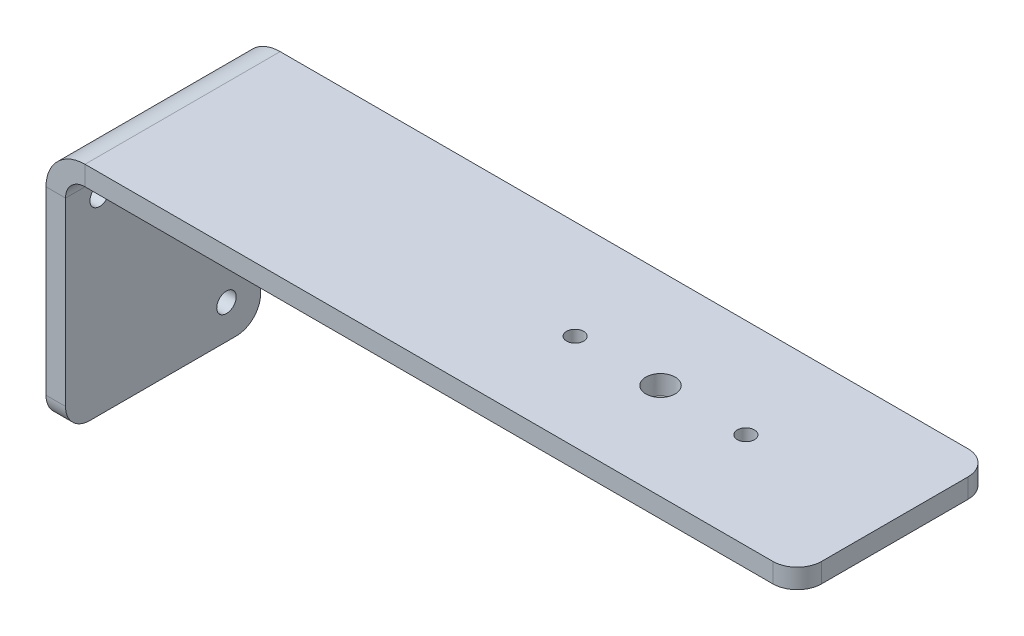
ISO-10303-21;
HEADER;
FILE_DESCRIPTION(('STEP AP214'),'2;1');
FILE_NAME('part.step','',(''),(''),'','','');
FILE_SCHEMA(('AUTOMOTIVE_DESIGN { 1 0 10303 214 1 1 1 1 }'));
ENDSEC;
DATA;
#1=APPLICATION_CONTEXT('core data for automotive mechanical design processes');
#2=APPLICATION_PROTOCOL_DEFINITION('international standard','automotive_design',2000,#1);
#3=PRODUCT_CONTEXT('',#1,'mechanical');
#4=PRODUCT('Part','Part','',(#3));
#5=PRODUCT_RELATED_PRODUCT_CATEGORY('part','',(#4));
#6=PRODUCT_DEFINITION_FORMATION('','',#4);
#7=PRODUCT_DEFINITION_CONTEXT('part definition',#1,'design');
#8=PRODUCT_DEFINITION('design','',#6,#7);
#9=PRODUCT_DEFINITION_SHAPE('','',#8);
#10=(LENGTH_UNIT() NAMED_UNIT(*) SI_UNIT(.MILLI.,.METRE.));
#11=(NAMED_UNIT(*) PLANE_ANGLE_UNIT() SI_UNIT($,.RADIAN.));
#12=(NAMED_UNIT(*) SI_UNIT($,.STERADIAN.) SOLID_ANGLE_UNIT());
#13=UNCERTAINTY_MEASURE_WITH_UNIT(LENGTH_MEASURE(1.E-05),#10,'distance_accuracy_value','');
#14=(GEOMETRIC_REPRESENTATION_CONTEXT(3) GLOBAL_UNCERTAINTY_ASSIGNED_CONTEXT((#13)) GLOBAL_UNIT_ASSIGNED_CONTEXT((#10,
#11,#12)) REPRESENTATION_CONTEXT('',''));
#15=CARTESIAN_POINT('',(0.,0.,0.));
#16=DIRECTION('',(0.,0.,1.));
#17=DIRECTION('',(1.,0.,0.));
#18=AXIS2_PLACEMENT_3D('',#15,#16,#17);
#19=CARTESIAN_POINT('',(0.,-4.,-40.));
#20=DIRECTION('',(0.,0.,-1.));
#21=DIRECTION('',(-1.,0.,0.));
#22=AXIS2_PLACEMENT_3D('',#19,#20,#21);
#23=PLANE('',#22);
#24=DIRECTION('',(-1.,0.,0.));
#25=VECTOR('',#24,1.);
#26=CARTESIAN_POINT('',(0.,0.,-40.));
#27=LINE('',#26,#25);
#28=CARTESIAN_POINT('',(145.,0.,-40.));
#29=VERTEX_POINT('',#28);
#30=CARTESIAN_POINT('',(3.99999999999999,0.,-40.));
#31=VERTEX_POINT('',#30);
#32=EDGE_CURVE('E188',#29,#31,#27,.T.);
#33=ORIENTED_EDGE('',*,*,#32,.F.);
#34=DIRECTION('',(0.,1.,0.));
#35=VECTOR('',#34,1.);
#36=CARTESIAN_POINT('',(145.,-4.,-40.));
#37=LINE('',#36,#35);
#38=CARTESIAN_POINT('',(145.,-4.,-40.));
#39=VERTEX_POINT('',#38);
#40=EDGE_CURVE('E208',#29,#39,#37,.F.);
#41=ORIENTED_EDGE('',*,*,#40,.T.);
#42=DIRECTION('',(-1.,0.,0.));
#43=VECTOR('',#42,1.);
#44=CARTESIAN_POINT('',(0.,-4.,-40.));
#45=LINE('',#44,#43);
#46=CARTESIAN_POINT('',(3.99999999999999,-4.,-40.));
#47=VERTEX_POINT('',#46);
#48=EDGE_CURVE('E191',#39,#47,#45,.T.);
#49=ORIENTED_EDGE('',*,*,#48,.T.);
#50=DIRECTION('',(0.,1.,0.));
#51=VECTOR('',#50,1.);
#52=CARTESIAN_POINT('',(3.99999999999999,-4.,-40.));
#53=LINE('',#52,#51);
#54=EDGE_CURVE('E170',#47,#31,#53,.T.);
#55=ORIENTED_EDGE('',*,*,#54,.T.);
#56=EDGE_LOOP('',(#33,#41,#49,#55));
#57=FACE_BOUND('',#56,.T.);
#58=ADVANCED_FACE('F35',(#57),#23,.T.);
#59=CARTESIAN_POINT('',(0.,-4.,0.));
#60=DIRECTION('',(0.,-1.,0.));
#61=DIRECTION('',(0.,0.,-1.));
#62=AXIS2_PLACEMENT_3D('',#59,#60,#61);
#63=PLANE('',#62);
#64=CARTESIAN_POINT('',(84.7635432294566,-4.,-19.7095851125222));
#65=DIRECTION('',(0.,-1.,0.));
#66=DIRECTION('',(0.,0.,-1.));
#67=AXIS2_PLACEMENT_3D('',#64,#65,#66);
#68=CIRCLE('',#67,1.75);
#69=CARTESIAN_POINT('',(84.7635432294566,-4.,-21.4595851125222));
#70=VERTEX_POINT('',#69);
#71=EDGE_CURVE('E259',#70,#70,#68,.T.);
#72=ORIENTED_EDGE('',*,*,#71,.F.);
#73=EDGE_LOOP('',(#72));
#74=FACE_BOUND('',#73,.T.);
#75=CARTESIAN_POINT('',(119.763543229457,-4.,-19.7095851125222));
#76=DIRECTION('',(0.,-1.,0.));
#77=DIRECTION('',(0.,0.,-1.));
#78=AXIS2_PLACEMENT_3D('',#75,#76,#77);
#79=CIRCLE('',#78,1.75);
#80=CARTESIAN_POINT('',(119.763543229457,-4.,-21.4595851125222));
#81=VERTEX_POINT('',#80);
#82=EDGE_CURVE('E264',#81,#81,#79,.T.);
#83=ORIENTED_EDGE('',*,*,#82,.F.);
#84=EDGE_LOOP('',(#83));
#85=FACE_BOUND('',#84,.T.);
#86=CARTESIAN_POINT('',(102.263543229457,-4.,-19.7095851125222));
#87=DIRECTION('',(0.,-1.,0.));
#88=DIRECTION('',(0.,0.,-1.));
#89=AXIS2_PLACEMENT_3D('',#86,#87,#88);
#90=CIRCLE('',#89,3.00983771193247);
#91=CARTESIAN_POINT('',(102.263543229457,-4.,-22.7194228244546));
#92=VERTEX_POINT('',#91);
#93=EDGE_CURVE('E267',#92,#92,#90,.T.);
#94=ORIENTED_EDGE('',*,*,#93,.F.);
#95=EDGE_LOOP('',(#94));
#96=FACE_BOUND('',#95,.T.);
#97=ORIENTED_EDGE('',*,*,#48,.F.);
#98=CARTESIAN_POINT('',(145.,-4.,-35.));
#99=DIRECTION('',(0.,-1.,0.));
#100=DIRECTION('',(0.,0.,-1.));
#101=AXIS2_PLACEMENT_3D('',#98,#99,#100);
#102=CIRCLE('',#101,5.);
#103=CARTESIAN_POINT('',(150.,-4.,-35.));
#104=VERTEX_POINT('',#103);
#105=EDGE_CURVE('E212',#39,#104,#102,.T.);
#106=ORIENTED_EDGE('',*,*,#105,.T.);
#107=DIRECTION('',(0.,0.,-1.));
#108=VECTOR('',#107,1.);
#109=CARTESIAN_POINT('',(150.,-4.,0.));
#110=LINE('',#109,#108);
#111=CARTESIAN_POINT('',(150.,-4.,-5.));
#112=VERTEX_POINT('',#111);
#113=EDGE_CURVE('E187',#112,#104,#110,.T.);
#114=ORIENTED_EDGE('',*,*,#113,.F.);
#115=CARTESIAN_POINT('',(145.,-4.,-5.));
#116=DIRECTION('',(0.,-1.,0.));
#117=DIRECTION('',(0.,0.,-1.));
#118=AXIS2_PLACEMENT_3D('',#115,#116,#117);
#119=CIRCLE('',#118,5.);
#120=CARTESIAN_POINT('',(145.,-4.,0.));
#121=VERTEX_POINT('',#120);
#122=EDGE_CURVE('E210',#112,#121,#119,.T.);
#123=ORIENTED_EDGE('',*,*,#122,.T.);
#124=DIRECTION('',(1.,0.,0.));
#125=VECTOR('',#124,1.);
#126=CARTESIAN_POINT('',(0.,-4.,0.));
#127=LINE('',#126,#125);
#128=CARTESIAN_POINT('',(3.99999999999999,-4.,0.));
#129=VERTEX_POINT('',#128);
#130=EDGE_CURVE('E184',#129,#121,#127,.T.);
#131=ORIENTED_EDGE('',*,*,#130,.F.);
#132=DIRECTION('',(0.,0.,-1.));
#133=VECTOR('',#132,1.);
#134=CARTESIAN_POINT('',(3.99999999999999,-4.,-40.));
#135=LINE('',#134,#133);
#136=EDGE_CURVE('E174',#47,#129,#135,.F.);
#137=ORIENTED_EDGE('',*,*,#136,.F.);
#138=EDGE_LOOP('',(#97,#106,#114,#123,#131,#137));
#139=FACE_BOUND('',#138,.T.);
#140=ADVANCED_FACE('F286',(#74,#85,#96,#139),#63,.T.);
#141=CARTESIAN_POINT('',(0.,0.,0.));
#142=DIRECTION('',(0.,-1.,0.));
#143=DIRECTION('',(0.,0.,-1.));
#144=AXIS2_PLACEMENT_3D('',#141,#142,#143);
#145=PLANE('',#144);
#146=CARTESIAN_POINT('',(84.7635432294566,0.,-19.7095851125222));
#147=DIRECTION('',(0.,1.,0.));
#148=DIRECTION('',(0.,0.,1.));
#149=AXIS2_PLACEMENT_3D('',#146,#147,#148);
#150=CIRCLE('',#149,1.75);
#151=CARTESIAN_POINT('',(84.7635432294566,0.,-17.9595851125222));
#152=VERTEX_POINT('',#151);
#153=EDGE_CURVE('E274',#152,#152,#150,.T.);
#154=ORIENTED_EDGE('',*,*,#153,.F.);
#155=EDGE_LOOP('',(#154));
#156=FACE_BOUND('',#155,.T.);
#157=CARTESIAN_POINT('',(119.763543229457,0.,-19.7095851125222));
#158=DIRECTION('',(0.,1.,0.));
#159=DIRECTION('',(0.,0.,1.));
#160=AXIS2_PLACEMENT_3D('',#157,#158,#159);
#161=CIRCLE('',#160,1.75);
#162=CARTESIAN_POINT('',(119.763543229457,0.,-17.9595851125222));
#163=VERTEX_POINT('',#162);
#164=EDGE_CURVE('E273',#163,#163,#161,.T.);
#165=ORIENTED_EDGE('',*,*,#164,.F.);
#166=EDGE_LOOP('',(#165));
#167=FACE_BOUND('',#166,.T.);
#168=CARTESIAN_POINT('',(102.263543229457,0.,-19.7095851125222));
#169=DIRECTION('',(0.,1.,0.));
#170=DIRECTION('',(0.,0.,1.));
#171=AXIS2_PLACEMENT_3D('',#168,#169,#170);
#172=CIRCLE('',#171,3.00983771193247);
#173=CARTESIAN_POINT('',(102.263543229457,0.,-16.6997474005897));
#174=VERTEX_POINT('',#173);
#175=EDGE_CURVE('E270',#174,#174,#172,.T.);
#176=ORIENTED_EDGE('',*,*,#175,.F.);
#177=EDGE_LOOP('',(#176));
#178=FACE_BOUND('',#177,.T.);
#179=DIRECTION('',(0.,0.,-1.));
#180=VECTOR('',#179,1.);
#181=CARTESIAN_POINT('',(150.,0.,0.));
#182=LINE('',#181,#180);
#183=CARTESIAN_POINT('',(150.,0.,-5.));
#184=VERTEX_POINT('',#183);
#185=CARTESIAN_POINT('',(150.,0.,-35.));
#186=VERTEX_POINT('',#185);
#187=EDGE_CURVE('E196',#184,#186,#182,.T.);
#188=ORIENTED_EDGE('',*,*,#187,.T.);
#189=CARTESIAN_POINT('',(145.,0.,-35.));
#190=DIRECTION('',(0.,-1.,0.));
#191=DIRECTION('',(0.,0.,-1.));
#192=AXIS2_PLACEMENT_3D('',#189,#190,#191);
#193=CIRCLE('',#192,5.);
#194=EDGE_CURVE('E206',#186,#29,#193,.F.);
#195=ORIENTED_EDGE('',*,*,#194,.T.);
#196=ORIENTED_EDGE('',*,*,#32,.T.);
#197=DIRECTION('',(0.,0.,-1.));
#198=VECTOR('',#197,1.);
#199=CARTESIAN_POINT('',(3.99999999999999,0.,-40.));
#200=LINE('',#199,#198);
#201=CARTESIAN_POINT('',(3.99999999999999,0.,0.));
#202=VERTEX_POINT('',#201);
#203=EDGE_CURVE('E135',#31,#202,#200,.F.);
#204=ORIENTED_EDGE('',*,*,#203,.T.);
#205=DIRECTION('',(1.,0.,0.));
#206=VECTOR('',#205,1.);
#207=CARTESIAN_POINT('',(0.,0.,0.));
#208=LINE('',#207,#206);
#209=CARTESIAN_POINT('',(145.,0.,0.));
#210=VERTEX_POINT('',#209);
#211=EDGE_CURVE('E181',#202,#210,#208,.T.);
#212=ORIENTED_EDGE('',*,*,#211,.T.);
#213=CARTESIAN_POINT('',(145.,0.,-5.));
#214=DIRECTION('',(0.,-1.,0.));
#215=DIRECTION('',(0.,0.,-1.));
#216=AXIS2_PLACEMENT_3D('',#213,#214,#215);
#217=CIRCLE('',#216,5.);
#218=EDGE_CURVE('E204',#210,#184,#217,.F.);
#219=ORIENTED_EDGE('',*,*,#218,.T.);
#220=EDGE_LOOP('',(#188,#195,#196,#204,#212,#219));
#221=FACE_BOUND('',#220,.T.);
#222=ADVANCED_FACE('F282',(#156,#167,#178,#221),#145,.F.);
#223=CARTESIAN_POINT('',(150.,-4.,0.));
#224=DIRECTION('',(1.,0.,0.));
#225=DIRECTION('',(0.,0.,-1.));
#226=AXIS2_PLACEMENT_3D('',#223,#224,#225);
#227=PLANE('',#226);
#228=ORIENTED_EDGE('',*,*,#113,.T.);
#229=DIRECTION('',(0.,1.,0.));
#230=VECTOR('',#229,1.);
#231=CARTESIAN_POINT('',(150.,-4.,-35.));
#232=LINE('',#231,#230);
#233=EDGE_CURVE('E201',#104,#186,#232,.T.);
#234=ORIENTED_EDGE('',*,*,#233,.T.);
#235=ORIENTED_EDGE('',*,*,#187,.F.);
#236=DIRECTION('',(0.,1.,0.));
#237=VECTOR('',#236,1.);
#238=CARTESIAN_POINT('',(150.,-4.,-5.));
#239=LINE('',#238,#237);
#240=EDGE_CURVE('E193',#184,#112,#239,.F.);
#241=ORIENTED_EDGE('',*,*,#240,.T.);
#242=EDGE_LOOP('',(#228,#234,#235,#241));
#243=FACE_BOUND('',#242,.T.);
#244=ADVANCED_FACE('F285',(#243),#227,.T.);
#245=CARTESIAN_POINT('',(0.,-4.,0.));
#246=DIRECTION('',(0.,0.,1.));
#247=DIRECTION('',(1.,0.,0.));
#248=AXIS2_PLACEMENT_3D('',#245,#246,#247);
#249=PLANE('',#248);
#250=ORIENTED_EDGE('',*,*,#130,.T.);
#251=DIRECTION('',(0.,1.,0.));
#252=VECTOR('',#251,1.);
#253=CARTESIAN_POINT('',(145.,-4.,0.));
#254=LINE('',#253,#252);
#255=EDGE_CURVE('E214',#121,#210,#254,.T.);
#256=ORIENTED_EDGE('',*,*,#255,.T.);
#257=ORIENTED_EDGE('',*,*,#211,.F.);
#258=DIRECTION('',(0.,1.,0.));
#259=VECTOR('',#258,1.);
#260=CARTESIAN_POINT('',(3.99999999999999,-4.,0.));
#261=LINE('',#260,#259);
#262=EDGE_CURVE('E178',#129,#202,#261,.T.);
#263=ORIENTED_EDGE('',*,*,#262,.F.);
#264=EDGE_LOOP('',(#250,#256,#257,#263));
#265=FACE_BOUND('',#264,.T.);
#266=ADVANCED_FACE('F306',(#265),#249,.T.);
#267=CARTESIAN_POINT('',(3.99999999999999,-8.,0.));
#268=DIRECTION('',(0.,0.,1.));
#269=DIRECTION('',(1.,0.,0.));
#270=AXIS2_PLACEMENT_3D('',#267,#268,#269);
#271=PLANE('',#270);
#272=DIRECTION('',(-1.,0.,0.));
#273=VECTOR('',#272,1.);
#274=CARTESIAN_POINT('',(0.,-7.99999999999999,0.));
#275=LINE('',#274,#273);
#276=CARTESIAN_POINT('',(0.,-7.99999999999999,0.));
#277=VERTEX_POINT('',#276);
#278=CARTESIAN_POINT('',(-4.00000000000001,-7.99999999999997,0.));
#279=VERTEX_POINT('',#278);
#280=EDGE_CURVE('E246',#277,#279,#275,.T.);
#281=ORIENTED_EDGE('',*,*,#280,.F.);
#282=CARTESIAN_POINT('',(3.99999999999999,-8.,0.));
#283=DIRECTION('',(0.,0.,-1.));
#284=DIRECTION('',(-1.,0.,0.));
#285=AXIS2_PLACEMENT_3D('',#282,#283,#284);
#286=CIRCLE('',#285,4.);
#287=EDGE_CURVE('E138',#129,#277,#286,.F.);
#288=ORIENTED_EDGE('',*,*,#287,.F.);
#289=ORIENTED_EDGE('',*,*,#262,.T.);
#290=CARTESIAN_POINT('',(3.99999999999999,-8.,0.));
#291=DIRECTION('',(0.,0.,-1.));
#292=DIRECTION('',(-1.,0.,0.));
#293=AXIS2_PLACEMENT_3D('',#290,#291,#292);
#294=CIRCLE('',#293,8.);
#295=EDGE_CURVE('E169',#202,#279,#294,.F.);
#296=ORIENTED_EDGE('',*,*,#295,.T.);
#297=EDGE_LOOP('',(#281,#288,#289,#296));
#298=FACE_BOUND('',#297,.T.);
#299=ADVANCED_FACE('F310',(#298),#271,.T.);
#300=CARTESIAN_POINT('',(3.99999999999999,-8.,-40.));
#301=DIRECTION('',(0.,0.,1.));
#302=DIRECTION('',(1.,0.,0.));
#303=AXIS2_PLACEMENT_3D('',#300,#301,#302);
#304=PLANE('',#303);
#305=CARTESIAN_POINT('',(3.99999999999999,-8.,-40.));
#306=DIRECTION('',(0.,0.,-1.));
#307=DIRECTION('',(-1.,0.,0.));
#308=AXIS2_PLACEMENT_3D('',#305,#306,#307);
#309=CIRCLE('',#308,4.);
#310=CARTESIAN_POINT('',(0.,-7.99999999999999,-40.));
#311=VERTEX_POINT('',#310);
#312=EDGE_CURVE('E145',#311,#47,#309,.T.);
#313=ORIENTED_EDGE('',*,*,#312,.F.);
#314=DIRECTION('',(-1.,0.,0.));
#315=VECTOR('',#314,1.);
#316=CARTESIAN_POINT('',(0.,-7.99999999999999,-40.));
#317=LINE('',#316,#315);
#318=CARTESIAN_POINT('',(-4.00000000000001,-7.99999999999997,-40.));
#319=VERTEX_POINT('',#318);
#320=EDGE_CURVE('E142',#311,#319,#317,.T.);
#321=ORIENTED_EDGE('',*,*,#320,.T.);
#322=CARTESIAN_POINT('',(3.99999999999999,-8.,-40.));
#323=DIRECTION('',(0.,0.,-1.));
#324=DIRECTION('',(-1.,0.,0.));
#325=AXIS2_PLACEMENT_3D('',#322,#323,#324);
#326=CIRCLE('',#325,8.);
#327=EDGE_CURVE('E128',#319,#31,#326,.T.);
#328=ORIENTED_EDGE('',*,*,#327,.T.);
#329=ORIENTED_EDGE('',*,*,#54,.F.);
#330=EDGE_LOOP('',(#313,#321,#328,#329));
#331=FACE_BOUND('',#330,.T.);
#332=ADVANCED_FACE('F143',(#331),#304,.F.);
#333=CARTESIAN_POINT('',(3.99999999999999,-8.,-40.));
#334=DIRECTION('',(0.,0.,-1.));
#335=DIRECTION('',(-1.,0.,0.));
#336=AXIS2_PLACEMENT_3D('',#333,#334,#335);
#337=CYLINDRICAL_SURFACE('',#336,8.);
#338=ORIENTED_EDGE('',*,*,#203,.F.);
#339=ORIENTED_EDGE('',*,*,#327,.F.);
#340=DIRECTION('',(0.,0.,1.));
#341=VECTOR('',#340,1.);
#342=CARTESIAN_POINT('',(-4.00000000000001,-7.99999999999997,0.));
#343=LINE('',#342,#341);
#344=EDGE_CURVE('E133',#319,#279,#343,.T.);
#345=ORIENTED_EDGE('',*,*,#344,.T.);
#346=ORIENTED_EDGE('',*,*,#295,.F.);
#347=EDGE_LOOP('',(#338,#339,#345,#346));
#348=FACE_BOUND('',#347,.T.);
#349=ADVANCED_FACE('F130',(#348),#337,.T.);
#350=CARTESIAN_POINT('',(3.99999999999999,-8.,-40.));
#351=DIRECTION('',(0.,0.,-1.));
#352=DIRECTION('',(-1.,0.,0.));
#353=AXIS2_PLACEMENT_3D('',#350,#351,#352);
#354=CYLINDRICAL_SURFACE('',#353,4.);
#355=ORIENTED_EDGE('',*,*,#136,.T.);
#356=ORIENTED_EDGE('',*,*,#287,.T.);
#357=DIRECTION('',(0.,0.,-1.));
#358=VECTOR('',#357,1.);
#359=CARTESIAN_POINT('',(0.,-7.99999999999999,0.));
#360=LINE('',#359,#358);
#361=EDGE_CURVE('E147',#277,#311,#360,.T.);
#362=ORIENTED_EDGE('',*,*,#361,.T.);
#363=ORIENTED_EDGE('',*,*,#312,.T.);
#364=EDGE_LOOP('',(#355,#356,#362,#363));
#365=FACE_BOUND('',#364,.T.);
#366=ADVANCED_FACE('F311',(#365),#354,.F.);
#367=CARTESIAN_POINT('',(-4.00000000000016,-50.,-40.));
#368=DIRECTION('',(0.,0.,1.));
#369=DIRECTION('',(1.,0.,0.));
#370=AXIS2_PLACEMENT_3D('',#367,#368,#369);
#371=PLANE('',#370);
#372=DIRECTION('',(0.,-1.,0.));
#373=VECTOR('',#372,1.);
#374=CARTESIAN_POINT('',(-1.60608141586784E-13,-50.,-40.));
#375=LINE('',#374,#373);
#376=CARTESIAN_POINT('',(-1.43150734892569E-13,-45.,-40.));
#377=VERTEX_POINT('',#376);
#378=EDGE_CURVE('E153',#311,#377,#375,.T.);
#379=ORIENTED_EDGE('',*,*,#378,.T.);
#380=DIRECTION('',(1.,0.,0.));
#381=VECTOR('',#380,1.);
#382=CARTESIAN_POINT('',(-4.00000000000014,-45.,-40.));
#383=LINE('',#382,#381);
#384=CARTESIAN_POINT('',(-4.00000000000014,-45.,-40.));
#385=VERTEX_POINT('',#384);
#386=EDGE_CURVE('E58',#377,#385,#383,.F.);
#387=ORIENTED_EDGE('',*,*,#386,.T.);
#388=DIRECTION('',(0.,-1.,0.));
#389=VECTOR('',#388,1.);
#390=CARTESIAN_POINT('',(-4.00000000000016,-50.,-40.));
#391=LINE('',#390,#389);
#392=EDGE_CURVE('E150',#319,#385,#391,.T.);
#393=ORIENTED_EDGE('',*,*,#392,.F.);
#394=ORIENTED_EDGE('',*,*,#320,.F.);
#395=EDGE_LOOP('',(#379,#387,#393,#394));
#396=FACE_BOUND('',#395,.T.);
#397=ADVANCED_FACE('F155',(#396),#371,.F.);
#398=CARTESIAN_POINT('',(-4.,-3.99999999999999,0.));
#399=DIRECTION('',(0.,0.,-1.));
#400=DIRECTION('',(-1.,0.,0.));
#401=AXIS2_PLACEMENT_3D('',#398,#399,#400);
#402=PLANE('',#401);
#403=DIRECTION('',(0.,1.,0.));
#404=VECTOR('',#403,1.);
#405=CARTESIAN_POINT('',(-4.,-3.99999999999999,0.));
#406=LINE('',#405,#404);
#407=CARTESIAN_POINT('',(-4.00000000000014,-45.,0.));
#408=VERTEX_POINT('',#407);
#409=EDGE_CURVE('E152',#408,#279,#406,.T.);
#410=ORIENTED_EDGE('',*,*,#409,.F.);
#411=DIRECTION('',(1.,0.,0.));
#412=VECTOR('',#411,1.);
#413=CARTESIAN_POINT('',(-4.00000000000014,-45.,0.));
#414=LINE('',#413,#412);
#415=CARTESIAN_POINT('',(-1.43150734892569E-13,-45.,0.));
#416=VERTEX_POINT('',#415);
#417=EDGE_CURVE('E11',#408,#416,#414,.T.);
#418=ORIENTED_EDGE('',*,*,#417,.T.);
#419=DIRECTION('',(0.,1.,0.));
#420=VECTOR('',#419,1.);
#421=CARTESIAN_POINT('',(0.,-4.,0.));
#422=LINE('',#421,#420);
#423=EDGE_CURVE('E157',#416,#277,#422,.T.);
#424=ORIENTED_EDGE('',*,*,#423,.T.);
#425=ORIENTED_EDGE('',*,*,#280,.T.);
#426=EDGE_LOOP('',(#410,#418,#424,#425));
#427=FACE_BOUND('',#426,.T.);
#428=ADVANCED_FACE('F242',(#427),#402,.F.);
#429=CARTESIAN_POINT('',(-3.99999999999999,0.,0.));
#430=DIRECTION('',(1.,0.,0.));
#431=DIRECTION('',(0.,1.,0.));
#432=AXIS2_PLACEMENT_3D('',#429,#430,#431);
#433=PLANE('',#432);
#434=CARTESIAN_POINT('',(-4.00000000000002,-11.,-7.));
#435=DIRECTION('',(1.,0.,0.));
#436=DIRECTION('',(0.,1.,0.));
#437=AXIS2_PLACEMENT_3D('',#434,#435,#436);
#438=CIRCLE('',#437,2.);
#439=CARTESIAN_POINT('',(-4.00000000000002,-8.99999999999997,-7.));
#440=VERTEX_POINT('',#439);
#441=EDGE_CURVE('E248',#440,#440,#438,.T.);
#442=ORIENTED_EDGE('',*,*,#441,.T.);
#443=EDGE_LOOP('',(#442));
#444=FACE_BOUND('',#443,.T.);
#445=CARTESIAN_POINT('',(-4.00000000000014,-43.,-33.));
#446=DIRECTION('',(1.,0.,0.));
#447=DIRECTION('',(0.,1.,0.));
#448=AXIS2_PLACEMENT_3D('',#445,#446,#447);
#449=CIRCLE('',#448,2.);
#450=CARTESIAN_POINT('',(-4.00000000000013,-41.,-33.));
#451=VERTEX_POINT('',#450);
#452=EDGE_CURVE('E252',#451,#451,#449,.T.);
#453=ORIENTED_EDGE('',*,*,#452,.T.);
#454=EDGE_LOOP('',(#453));
#455=FACE_BOUND('',#454,.T.);
#456=ORIENTED_EDGE('',*,*,#392,.T.);
#457=CARTESIAN_POINT('',(-4.00000000000014,-45.,-35.));
#458=DIRECTION('',(1.,0.,0.));
#459=DIRECTION('',(0.,1.,0.));
#460=AXIS2_PLACEMENT_3D('',#457,#458,#459);
#461=CIRCLE('',#460,5.);
#462=CARTESIAN_POINT('',(-4.00000000000016,-50.,-35.));
#463=VERTEX_POINT('',#462);
#464=EDGE_CURVE('E43',#385,#463,#461,.F.);
#465=ORIENTED_EDGE('',*,*,#464,.T.);
#466=DIRECTION('',(0.,0.,1.));
#467=VECTOR('',#466,1.);
#468=CARTESIAN_POINT('',(-4.00000000000016,-50.,0.));
#469=LINE('',#468,#467);
#470=CARTESIAN_POINT('',(-4.00000000000016,-50.,-5.));
#471=VERTEX_POINT('',#470);
#472=EDGE_CURVE('E156',#463,#471,#469,.T.);
#473=ORIENTED_EDGE('',*,*,#472,.T.);
#474=CARTESIAN_POINT('',(-4.00000000000014,-45.,-5.));
#475=DIRECTION('',(1.,0.,0.));
#476=DIRECTION('',(0.,1.,0.));
#477=AXIS2_PLACEMENT_3D('',#474,#475,#476);
#478=CIRCLE('',#477,5.);
#479=EDGE_CURVE('E50',#471,#408,#478,.F.);
#480=ORIENTED_EDGE('',*,*,#479,.T.);
#481=ORIENTED_EDGE('',*,*,#409,.T.);
#482=ORIENTED_EDGE('',*,*,#344,.F.);
#483=EDGE_LOOP('',(#456,#465,#473,#480,#481,#482));
#484=FACE_BOUND('',#483,.T.);
#485=ADVANCED_FACE('F149',(#444,#455,#484),#433,.F.);
#486=CARTESIAN_POINT('',(0.,0.,0.));
#487=DIRECTION('',(1.,0.,0.));
#488=DIRECTION('',(0.,1.,0.));
#489=AXIS2_PLACEMENT_3D('',#486,#487,#488);
#490=PLANE('',#489);
#491=CARTESIAN_POINT('',(0.,-11.,-7.));
#492=DIRECTION('',(1.,0.,0.));
#493=DIRECTION('',(0.,1.,0.));
#494=AXIS2_PLACEMENT_3D('',#491,#492,#493);
#495=CIRCLE('',#494,2.);
#496=CARTESIAN_POINT('',(0.,-8.99999999999998,-7.));
#497=VERTEX_POINT('',#496);
#498=EDGE_CURVE('E255',#497,#497,#495,.T.);
#499=ORIENTED_EDGE('',*,*,#498,.F.);
#500=EDGE_LOOP('',(#499));
#501=FACE_BOUND('',#500,.T.);
#502=CARTESIAN_POINT('',(-1.50133697570255E-13,-43.,-33.));
#503=DIRECTION('',(1.,0.,0.));
#504=DIRECTION('',(0.,1.,0.));
#505=AXIS2_PLACEMENT_3D('',#502,#503,#504);
#506=CIRCLE('',#505,2.);
#507=CARTESIAN_POINT('',(-1.43150734892569E-13,-41.,-33.));
#508=VERTEX_POINT('',#507);
#509=EDGE_CURVE('E256',#508,#508,#506,.T.);
#510=ORIENTED_EDGE('',*,*,#509,.F.);
#511=EDGE_LOOP('',(#510));
#512=FACE_BOUND('',#511,.T.);
#513=DIRECTION('',(0.,0.,1.));
#514=VECTOR('',#513,1.);
#515=CARTESIAN_POINT('',(-1.60608141586784E-13,-50.,0.));
#516=LINE('',#515,#514);
#517=CARTESIAN_POINT('',(-1.60608141586784E-13,-50.,-35.));
#518=VERTEX_POINT('',#517);
#519=CARTESIAN_POINT('',(-1.60608141586784E-13,-50.,-5.));
#520=VERTEX_POINT('',#519);
#521=EDGE_CURVE('E160',#518,#520,#516,.T.);
#522=ORIENTED_EDGE('',*,*,#521,.F.);
#523=CARTESIAN_POINT('',(-1.43114686768087E-13,-45.,-35.));
#524=DIRECTION('',(1.,0.,0.));
#525=DIRECTION('',(0.,1.,0.));
#526=AXIS2_PLACEMENT_3D('',#523,#524,#525);
#527=CIRCLE('',#526,5.);
#528=EDGE_CURVE('E224',#518,#377,#527,.T.);
#529=ORIENTED_EDGE('',*,*,#528,.T.);
#530=ORIENTED_EDGE('',*,*,#378,.F.);
#531=ORIENTED_EDGE('',*,*,#361,.F.);
#532=ORIENTED_EDGE('',*,*,#423,.F.);
#533=CARTESIAN_POINT('',(-1.43114686768087E-13,-45.,-5.));
#534=DIRECTION('',(1.,0.,0.));
#535=DIRECTION('',(0.,1.,0.));
#536=AXIS2_PLACEMENT_3D('',#533,#534,#535);
#537=CIRCLE('',#536,5.);
#538=EDGE_CURVE('E222',#416,#520,#537,.T.);
#539=ORIENTED_EDGE('',*,*,#538,.T.);
#540=EDGE_LOOP('',(#522,#529,#530,#531,#532,#539));
#541=FACE_BOUND('',#540,.T.);
#542=ADVANCED_FACE('F236',(#501,#512,#541),#490,.T.);
#543=CARTESIAN_POINT('',(-4.00000000000016,-50.,0.));
#544=DIRECTION('',(0.,1.,0.));
#545=DIRECTION('',(-1.,0.,0.));
#546=AXIS2_PLACEMENT_3D('',#543,#544,#545);
#547=PLANE('',#546);
#548=ORIENTED_EDGE('',*,*,#472,.F.);
#549=DIRECTION('',(1.,0.,0.));
#550=VECTOR('',#549,1.);
#551=CARTESIAN_POINT('',(-4.00000000000016,-50.,-35.));
#552=LINE('',#551,#550);
#553=EDGE_CURVE('E219',#463,#518,#552,.T.);
#554=ORIENTED_EDGE('',*,*,#553,.T.);
#555=ORIENTED_EDGE('',*,*,#521,.T.);
#556=DIRECTION('',(1.,0.,0.));
#557=VECTOR('',#556,1.);
#558=CARTESIAN_POINT('',(-4.00000000000016,-50.,-5.));
#559=LINE('',#558,#557);
#560=EDGE_CURVE('E217',#520,#471,#559,.F.);
#561=ORIENTED_EDGE('',*,*,#560,.T.);
#562=EDGE_LOOP('',(#548,#554,#555,#561));
#563=FACE_BOUND('',#562,.T.);
#564=ADVANCED_FACE('F231',(#563),#547,.F.);
#565=CARTESIAN_POINT('',(-10.0000000000002,-43.,-33.));
#566=DIRECTION('',(1.,0.,0.));
#567=DIRECTION('',(0.,1.,0.));
#568=AXIS2_PLACEMENT_3D('',#565,#566,#567);
#569=CYLINDRICAL_SURFACE('',#568,2.);
#570=ORIENTED_EDGE('',*,*,#509,.T.);
#571=EDGE_LOOP('',(#570));
#572=FACE_BOUND('',#571,.T.);
#573=ORIENTED_EDGE('',*,*,#452,.F.);
#574=EDGE_LOOP('',(#573));
#575=FACE_BOUND('',#574,.T.);
#576=ADVANCED_FACE('F325',(#572,#575),#569,.F.);
#577=CARTESIAN_POINT('',(-10.,-10.9999999999999,-7.));
#578=DIRECTION('',(1.,0.,0.));
#579=DIRECTION('',(0.,1.,0.));
#580=AXIS2_PLACEMENT_3D('',#577,#578,#579);
#581=CYLINDRICAL_SURFACE('',#580,2.);
#582=ORIENTED_EDGE('',*,*,#498,.T.);
#583=EDGE_LOOP('',(#582));
#584=FACE_BOUND('',#583,.T.);
#585=ORIENTED_EDGE('',*,*,#441,.F.);
#586=EDGE_LOOP('',(#585));
#587=FACE_BOUND('',#586,.T.);
#588=ADVANCED_FACE('F318',(#584,#587),#581,.F.);
#589=CARTESIAN_POINT('',(145.,-4.,-35.));
#590=DIRECTION('',(0.,1.,0.));
#591=DIRECTION('',(0.,0.,1.));
#592=AXIS2_PLACEMENT_3D('',#589,#590,#591);
#593=CYLINDRICAL_SURFACE('',#592,5.);
#594=ORIENTED_EDGE('',*,*,#105,.F.);
#595=ORIENTED_EDGE('',*,*,#40,.F.);
#596=ORIENTED_EDGE('',*,*,#194,.F.);
#597=ORIENTED_EDGE('',*,*,#233,.F.);
#598=EDGE_LOOP('',(#594,#595,#596,#597));
#599=FACE_BOUND('',#598,.T.);
#600=ADVANCED_FACE('F316',(#599),#593,.T.);
#601=CARTESIAN_POINT('',(145.,-4.,-5.));
#602=DIRECTION('',(0.,1.,0.));
#603=DIRECTION('',(0.,0.,1.));
#604=AXIS2_PLACEMENT_3D('',#601,#602,#603);
#605=CYLINDRICAL_SURFACE('',#604,5.);
#606=ORIENTED_EDGE('',*,*,#122,.F.);
#607=ORIENTED_EDGE('',*,*,#240,.F.);
#608=ORIENTED_EDGE('',*,*,#218,.F.);
#609=ORIENTED_EDGE('',*,*,#255,.F.);
#610=EDGE_LOOP('',(#606,#607,#608,#609));
#611=FACE_BOUND('',#610,.T.);
#612=ADVANCED_FACE('F299',(#611),#605,.T.);
#613=CARTESIAN_POINT('',(-4.00000000000014,-45.,-35.));
#614=DIRECTION('',(1.,0.,0.));
#615=DIRECTION('',(0.,1.,0.));
#616=AXIS2_PLACEMENT_3D('',#613,#614,#615);
#617=CYLINDRICAL_SURFACE('',#616,5.);
#618=ORIENTED_EDGE('',*,*,#464,.F.);
#619=ORIENTED_EDGE('',*,*,#386,.F.);
#620=ORIENTED_EDGE('',*,*,#528,.F.);
#621=ORIENTED_EDGE('',*,*,#553,.F.);
#622=EDGE_LOOP('',(#618,#619,#620,#621));
#623=FACE_BOUND('',#622,.T.);
#624=ADVANCED_FACE('F234',(#623),#617,.T.);
#625=CARTESIAN_POINT('',(-4.00000000000014,-45.,-5.));
#626=DIRECTION('',(1.,0.,0.));
#627=DIRECTION('',(0.,1.,0.));
#628=AXIS2_PLACEMENT_3D('',#625,#626,#627);
#629=CYLINDRICAL_SURFACE('',#628,5.);
#630=ORIENTED_EDGE('',*,*,#479,.F.);
#631=ORIENTED_EDGE('',*,*,#560,.F.);
#632=ORIENTED_EDGE('',*,*,#538,.F.);
#633=ORIENTED_EDGE('',*,*,#417,.F.);
#634=EDGE_LOOP('',(#630,#631,#632,#633));
#635=FACE_BOUND('',#634,.T.);
#636=ADVANCED_FACE('F37',(#635),#629,.T.);
#637=CARTESIAN_POINT('',(102.263543229457,-10.,-19.7095851125222));
#638=DIRECTION('',(0.,1.,0.));
#639=DIRECTION('',(0.,0.,1.));
#640=AXIS2_PLACEMENT_3D('',#637,#638,#639);
#641=CYLINDRICAL_SURFACE('',#640,3.00983771193247);
#642=ORIENTED_EDGE('',*,*,#93,.T.);
#643=EDGE_LOOP('',(#642));
#644=FACE_BOUND('',#643,.T.);
#645=ORIENTED_EDGE('',*,*,#175,.T.);
#646=EDGE_LOOP('',(#645));
#647=FACE_BOUND('',#646,.T.);
#648=ADVANCED_FACE('F367',(#644,#647),#641,.F.);
#649=CARTESIAN_POINT('',(119.763543229457,-10.,-19.7095851125222));
#650=DIRECTION('',(0.,1.,0.));
#651=DIRECTION('',(0.,0.,1.));
#652=AXIS2_PLACEMENT_3D('',#649,#650,#651);
#653=CYLINDRICAL_SURFACE('',#652,1.75);
#654=ORIENTED_EDGE('',*,*,#82,.T.);
#655=EDGE_LOOP('',(#654));
#656=FACE_BOUND('',#655,.T.);
#657=ORIENTED_EDGE('',*,*,#164,.T.);
#658=EDGE_LOOP('',(#657));
#659=FACE_BOUND('',#658,.T.);
#660=ADVANCED_FACE('F280',(#656,#659),#653,.F.);
#661=CARTESIAN_POINT('',(84.7635432294566,-10.,-19.7095851125222));
#662=DIRECTION('',(0.,1.,0.));
#663=DIRECTION('',(0.,0.,1.));
#664=AXIS2_PLACEMENT_3D('',#661,#662,#663);
#665=CYLINDRICAL_SURFACE('',#664,1.75);
#666=ORIENTED_EDGE('',*,*,#71,.T.);
#667=EDGE_LOOP('',(#666));
#668=FACE_BOUND('',#667,.T.);
#669=ORIENTED_EDGE('',*,*,#153,.T.);
#670=EDGE_LOOP('',(#669));
#671=FACE_BOUND('',#670,.T.);
#672=ADVANCED_FACE('F371',(#668,#671),#665,.F.);
#673=CLOSED_SHELL('',(#58,#140,#222,#244,#266,#299,#332,#349,#366,#397,#428,#485,#542,#564,#576,
#588,#600,#612,#624,#636,#648,#660,#672));
#674=MANIFOLD_SOLID_BREP('B2',#673);
#675=ADVANCED_BREP_SHAPE_REPRESENTATION('',(#18,#674),#14);
#676=SHAPE_DEFINITION_REPRESENTATION(#9,#675);
ENDSEC;
END-ISO-10303-21;
